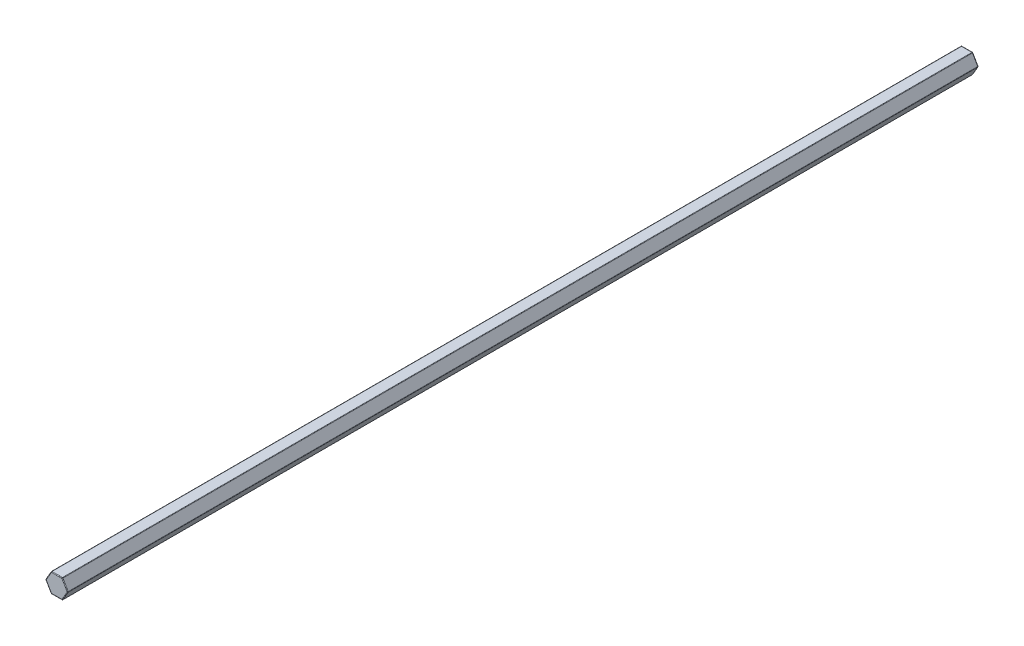
ISO-10303-21;
HEADER;
FILE_DESCRIPTION(('STEP AP214'),'2;1');
FILE_NAME('part.step','',(''),(''),'','','');
FILE_SCHEMA(('AUTOMOTIVE_DESIGN { 1 0 10303 214 1 1 1 1 }'));
ENDSEC;
DATA;
#1=APPLICATION_CONTEXT('core data for automotive mechanical design processes');
#2=APPLICATION_PROTOCOL_DEFINITION('international standard','automotive_design',2000,#1);
#3=PRODUCT_CONTEXT('',#1,'mechanical');
#4=PRODUCT('Part','Part','',(#3));
#5=PRODUCT_RELATED_PRODUCT_CATEGORY('part','',(#4));
#6=PRODUCT_DEFINITION_FORMATION('','',#4);
#7=PRODUCT_DEFINITION_CONTEXT('part definition',#1,'design');
#8=PRODUCT_DEFINITION('design','',#6,#7);
#9=PRODUCT_DEFINITION_SHAPE('','',#8);
#10=(LENGTH_UNIT() NAMED_UNIT(*) SI_UNIT(.MILLI.,.METRE.));
#11=(NAMED_UNIT(*) PLANE_ANGLE_UNIT() SI_UNIT($,.RADIAN.));
#12=(NAMED_UNIT(*) SI_UNIT($,.STERADIAN.) SOLID_ANGLE_UNIT());
#13=UNCERTAINTY_MEASURE_WITH_UNIT(LENGTH_MEASURE(1.E-05),#10,'distance_accuracy_value','');
#14=(GEOMETRIC_REPRESENTATION_CONTEXT(3) GLOBAL_UNCERTAINTY_ASSIGNED_CONTEXT((#13)) GLOBAL_UNIT_ASSIGNED_CONTEXT((#10,
#11,#12)) REPRESENTATION_CONTEXT('',''));
#15=CARTESIAN_POINT('',(0.,0.,0.));
#16=DIRECTION('',(0.,0.,1.));
#17=DIRECTION('',(1.,0.,0.));
#18=AXIS2_PLACEMENT_3D('',#15,#16,#17);
#19=CARTESIAN_POINT('',(1.8330871046771,-3.17499999999998,150.));
#20=DIRECTION('',(-0.866025403784441,0.499999999999995,0.));
#21=DIRECTION('',(-0.499999999999995,-0.866025403784441,0.));
#22=AXIS2_PLACEMENT_3D('',#19,#20,#21);
#23=PLANE('',#22);
#24=DIRECTION('',(0.,0.,-1.));
#25=VECTOR('',#24,1.);
#26=CARTESIAN_POINT('',(1.89082213159606,-3.07499999999998,150.));
#27=LINE('',#26,#25);
#28=CARTESIAN_POINT('',(1.89082213159606,-3.07499999999998,149.8));
#29=VERTEX_POINT('',#28);
#30=CARTESIAN_POINT('',(1.89082213159606,-3.07499999999998,-149.8));
#31=VERTEX_POINT('',#30);
#32=EDGE_CURVE('E313',#29,#31,#27,.T.);
#33=ORIENTED_EDGE('',*,*,#32,.T.);
#34=DIRECTION('',(0.499999999999995,0.866025403784441,0.));
#35=VECTOR('',#34,1.);
#36=CARTESIAN_POINT('',(1.8330871046771,-3.17499999999998,-149.8));
#37=LINE('',#36,#35);
#38=CARTESIAN_POINT('',(3.60843918243517,-0.1,-149.8));
#39=VERTEX_POINT('',#38);
#40=EDGE_CURVE('E316',#31,#39,#37,.T.);
#41=ORIENTED_EDGE('',*,*,#40,.T.);
#42=DIRECTION('',(0.,0.,-1.));
#43=VECTOR('',#42,1.);
#44=CARTESIAN_POINT('',(3.60843918243516,-0.1,150.));
#45=LINE('',#44,#43);
#46=CARTESIAN_POINT('',(3.60843918243517,-0.1,149.8));
#47=VERTEX_POINT('',#46);
#48=EDGE_CURVE('E311',#39,#47,#45,.F.);
#49=ORIENTED_EDGE('',*,*,#48,.T.);
#50=DIRECTION('',(0.499999999999995,0.866025403784441,0.));
#51=VECTOR('',#50,1.);
#52=CARTESIAN_POINT('',(1.8330871046771,-3.17499999999998,149.8));
#53=LINE('',#52,#51);
#54=EDGE_CURVE('E309',#47,#29,#53,.F.);
#55=ORIENTED_EDGE('',*,*,#54,.T.);
#56=EDGE_LOOP('',(#33,#41,#49,#55));
#57=FACE_BOUND('',#56,.T.);
#58=ADVANCED_FACE('F36',(#57),#23,.F.);
#59=CARTESIAN_POINT('',(3.66617420935413,0.,150.));
#60=DIRECTION('',(-0.866025403784438,-0.500000000000001,0.));
#61=DIRECTION('',(0.500000000000001,-0.866025403784438,0.));
#62=AXIS2_PLACEMENT_3D('',#59,#60,#61);
#63=PLANE('',#62);
#64=DIRECTION('',(0.,0.,-1.));
#65=VECTOR('',#64,1.);
#66=CARTESIAN_POINT('',(3.60843918243516,0.0999999999999989,150.));
#67=LINE('',#66,#65);
#68=CARTESIAN_POINT('',(3.60843918243516,0.0999999999999988,149.8));
#69=VERTEX_POINT('',#68);
#70=CARTESIAN_POINT('',(3.60843918243516,0.0999999999999989,-149.8));
#71=VERTEX_POINT('',#70);
#72=EDGE_CURVE('E170',#69,#71,#67,.T.);
#73=ORIENTED_EDGE('',*,*,#72,.T.);
#74=DIRECTION('',(-0.500000000000001,0.866025403784438,0.));
#75=VECTOR('',#74,1.);
#76=CARTESIAN_POINT('',(3.66617420935413,0.,-149.8));
#77=LINE('',#76,#75);
#78=CARTESIAN_POINT('',(1.89082213159602,3.07500000000001,-149.8));
#79=VERTEX_POINT('',#78);
#80=EDGE_CURVE('E166',#71,#79,#77,.T.);
#81=ORIENTED_EDGE('',*,*,#80,.T.);
#82=DIRECTION('',(0.,0.,-1.));
#83=VECTOR('',#82,1.);
#84=CARTESIAN_POINT('',(1.89082213159602,3.07500000000001,150.));
#85=LINE('',#84,#83);
#86=CARTESIAN_POINT('',(1.89082213159602,3.07500000000001,149.8));
#87=VERTEX_POINT('',#86);
#88=EDGE_CURVE('E160',#79,#87,#85,.F.);
#89=ORIENTED_EDGE('',*,*,#88,.T.);
#90=DIRECTION('',(-0.500000000000001,0.866025403784438,0.));
#91=VECTOR('',#90,1.);
#92=CARTESIAN_POINT('',(3.66617420935413,0.,149.8));
#93=LINE('',#92,#91);
#94=EDGE_CURVE('E163',#87,#69,#93,.F.);
#95=ORIENTED_EDGE('',*,*,#94,.T.);
#96=EDGE_LOOP('',(#73,#81,#89,#95));
#97=FACE_BOUND('',#96,.T.);
#98=ADVANCED_FACE('F162',(#97),#63,.F.);
#99=CARTESIAN_POINT('',(1.83308710467706,3.17500000000001,150.));
#100=DIRECTION('',(0.,-1.,0.));
#101=DIRECTION('',(1.,0.,0.));
#102=AXIS2_PLACEMENT_3D('',#99,#100,#101);
#103=PLANE('',#102);
#104=DIRECTION('',(0.,0.,-1.));
#105=VECTOR('',#104,1.);
#106=CARTESIAN_POINT('',(1.71761705083913,3.17500000000001,150.));
#107=LINE('',#106,#105);
#108=CARTESIAN_POINT('',(1.71761705083913,3.17500000000001,149.8));
#109=VERTEX_POINT('',#108);
#110=CARTESIAN_POINT('',(1.71761705083913,3.17500000000001,-149.8));
#111=VERTEX_POINT('',#110);
#112=EDGE_CURVE('E193',#109,#111,#107,.T.);
#113=ORIENTED_EDGE('',*,*,#112,.T.);
#114=DIRECTION('',(-1.,0.,0.));
#115=VECTOR('',#114,1.);
#116=CARTESIAN_POINT('',(1.83308710467706,3.17500000000001,-149.8));
#117=LINE('',#116,#115);
#118=CARTESIAN_POINT('',(-1.71761705083915,3.17499999999999,-149.8));
#119=VERTEX_POINT('',#118);
#120=EDGE_CURVE('E323',#111,#119,#117,.T.);
#121=ORIENTED_EDGE('',*,*,#120,.T.);
#122=DIRECTION('',(0.,0.,-1.));
#123=VECTOR('',#122,1.);
#124=CARTESIAN_POINT('',(-1.71761705083915,3.17499999999999,150.));
#125=LINE('',#124,#123);
#126=CARTESIAN_POINT('',(-1.71761705083915,3.17499999999999,149.8));
#127=VERTEX_POINT('',#126);
#128=EDGE_CURVE('E320',#119,#127,#125,.F.);
#129=ORIENTED_EDGE('',*,*,#128,.T.);
#130=DIRECTION('',(-1.,0.,0.));
#131=VECTOR('',#130,1.);
#132=CARTESIAN_POINT('',(1.83308710467706,3.17500000000001,149.8));
#133=LINE('',#132,#131);
#134=EDGE_CURVE('E318',#127,#109,#133,.F.);
#135=ORIENTED_EDGE('',*,*,#134,.T.);
#136=EDGE_LOOP('',(#113,#121,#129,#135));
#137=FACE_BOUND('',#136,.T.);
#138=ADVANCED_FACE('F442',(#137),#103,.F.);
#139=CARTESIAN_POINT('',(-1.83308710467708,3.17499999999999,150.));
#140=DIRECTION('',(0.866025403784442,-0.499999999999995,0.));
#141=DIRECTION('',(0.499999999999995,0.866025403784442,0.));
#142=AXIS2_PLACEMENT_3D('',#139,#140,#141);
#143=PLANE('',#142);
#144=DIRECTION('',(0.,0.,-1.));
#145=VECTOR('',#144,1.);
#146=CARTESIAN_POINT('',(-1.89082213159604,3.07499999999999,150.));
#147=LINE('',#146,#145);
#148=CARTESIAN_POINT('',(-1.89082213159604,3.07499999999999,149.8));
#149=VERTEX_POINT('',#148);
#150=CARTESIAN_POINT('',(-1.89082213159604,3.07499999999999,-149.8));
#151=VERTEX_POINT('',#150);
#152=EDGE_CURVE('E378',#149,#151,#147,.T.);
#153=ORIENTED_EDGE('',*,*,#152,.T.);
#154=DIRECTION('',(-0.499999999999995,-0.866025403784442,0.));
#155=VECTOR('',#154,1.);
#156=CARTESIAN_POINT('',(-1.83308710467708,3.17499999999999,-149.8));
#157=LINE('',#156,#155);
#158=CARTESIAN_POINT('',(-3.60843918243516,0.0999999999999749,-149.8));
#159=VERTEX_POINT('',#158);
#160=EDGE_CURVE('E382',#151,#159,#157,.T.);
#161=ORIENTED_EDGE('',*,*,#160,.T.);
#162=DIRECTION('',(0.,0.,-1.));
#163=VECTOR('',#162,1.);
#164=CARTESIAN_POINT('',(-3.60843918243516,0.0999999999999751,150.));
#165=LINE('',#164,#163);
#166=CARTESIAN_POINT('',(-3.60843918243516,0.0999999999999749,149.8));
#167=VERTEX_POINT('',#166);
#168=EDGE_CURVE('E380',#159,#167,#165,.F.);
#169=ORIENTED_EDGE('',*,*,#168,.T.);
#170=DIRECTION('',(-0.499999999999995,-0.866025403784442,0.));
#171=VECTOR('',#170,1.);
#172=CARTESIAN_POINT('',(-1.83308710467708,3.17499999999999,149.8));
#173=LINE('',#172,#171);
#174=EDGE_CURVE('E376',#167,#149,#173,.F.);
#175=ORIENTED_EDGE('',*,*,#174,.T.);
#176=EDGE_LOOP('',(#153,#161,#169,#175));
#177=FACE_BOUND('',#176,.T.);
#178=ADVANCED_FACE('F512',(#177),#143,.F.);
#179=CARTESIAN_POINT('',(-3.66617420935413,0.,150.));
#180=DIRECTION('',(0.866025403784434,0.500000000000007,0.));
#181=DIRECTION('',(-0.500000000000007,0.866025403784435,0.));
#182=AXIS2_PLACEMENT_3D('',#179,#180,#181);
#183=PLANE('',#182);
#184=DIRECTION('',(0.,0.,-1.));
#185=VECTOR('',#184,1.);
#186=CARTESIAN_POINT('',(-3.60843918243516,-0.100000000000026,150.));
#187=LINE('',#186,#185);
#188=CARTESIAN_POINT('',(-3.60843918243516,-0.100000000000026,149.8));
#189=VERTEX_POINT('',#188);
#190=CARTESIAN_POINT('',(-3.60843918243516,-0.100000000000026,-149.8));
#191=VERTEX_POINT('',#190);
#192=EDGE_CURVE('E304',#189,#191,#187,.T.);
#193=ORIENTED_EDGE('',*,*,#192,.T.);
#194=DIRECTION('',(0.500000000000007,-0.866025403784435,0.));
#195=VECTOR('',#194,1.);
#196=CARTESIAN_POINT('',(-3.66617420935413,0.,-149.8));
#197=LINE('',#196,#195);
#198=CARTESIAN_POINT('',(-1.890822131596,-3.07500000000002,-149.8));
#199=VERTEX_POINT('',#198);
#200=EDGE_CURVE('E307',#191,#199,#197,.T.);
#201=ORIENTED_EDGE('',*,*,#200,.T.);
#202=DIRECTION('',(0.,0.,-1.));
#203=VECTOR('',#202,1.);
#204=CARTESIAN_POINT('',(-1.890822131596,-3.07500000000002,150.));
#205=LINE('',#204,#203);
#206=CARTESIAN_POINT('',(-1.890822131596,-3.07500000000002,149.8));
#207=VERTEX_POINT('',#206);
#208=EDGE_CURVE('E287',#199,#207,#205,.F.);
#209=ORIENTED_EDGE('',*,*,#208,.T.);
#210=DIRECTION('',(0.500000000000007,-0.866025403784435,0.));
#211=VECTOR('',#210,1.);
#212=CARTESIAN_POINT('',(-3.66617420935413,0.,149.8));
#213=LINE('',#212,#211);
#214=EDGE_CURVE('E296',#207,#189,#213,.F.);
#215=ORIENTED_EDGE('',*,*,#214,.T.);
#216=EDGE_LOOP('',(#193,#201,#209,#215));
#217=FACE_BOUND('',#216,.T.);
#218=ADVANCED_FACE('F551',(#217),#183,.F.);
#219=CARTESIAN_POINT('',(-1.83308710467703,-3.17500000000002,150.));
#220=DIRECTION('',(0.,1.,0.));
#221=DIRECTION('',(-1.,0.,0.));
#222=AXIS2_PLACEMENT_3D('',#219,#220,#221);
#223=PLANE('',#222);
#224=DIRECTION('',(0.,0.,-1.));
#225=VECTOR('',#224,1.);
#226=CARTESIAN_POINT('',(-1.71761705083911,-3.17500000000002,150.));
#227=LINE('',#226,#225);
#228=CARTESIAN_POINT('',(-1.71761705083911,-3.17500000000002,149.8));
#229=VERTEX_POINT('',#228);
#230=CARTESIAN_POINT('',(-1.71761705083911,-3.17500000000002,-149.8));
#231=VERTEX_POINT('',#230);
#232=EDGE_CURVE('E289',#229,#231,#227,.T.);
#233=ORIENTED_EDGE('',*,*,#232,.T.);
#234=DIRECTION('',(1.,0.,0.));
#235=VECTOR('',#234,1.);
#236=CARTESIAN_POINT('',(-1.83308710467703,-3.17500000000002,-149.8));
#237=LINE('',#236,#235);
#238=CARTESIAN_POINT('',(1.71761705083918,-3.17499999999998,-149.8));
#239=VERTEX_POINT('',#238);
#240=EDGE_CURVE('E293',#231,#239,#237,.T.);
#241=ORIENTED_EDGE('',*,*,#240,.T.);
#242=DIRECTION('',(0.,0.,-1.));
#243=VECTOR('',#242,1.);
#244=CARTESIAN_POINT('',(1.71761705083918,-3.17499999999998,150.));
#245=LINE('',#244,#243);
#246=CARTESIAN_POINT('',(1.71761705083918,-3.17499999999998,149.8));
#247=VERTEX_POINT('',#246);
#248=EDGE_CURVE('E294',#239,#247,#245,.F.);
#249=ORIENTED_EDGE('',*,*,#248,.T.);
#250=DIRECTION('',(1.,0.,0.));
#251=VECTOR('',#250,1.);
#252=CARTESIAN_POINT('',(-1.83308710467703,-3.17500000000002,149.8));
#253=LINE('',#252,#251);
#254=EDGE_CURVE('E298',#247,#229,#253,.F.);
#255=ORIENTED_EDGE('',*,*,#254,.T.);
#256=EDGE_LOOP('',(#233,#241,#249,#255));
#257=FACE_BOUND('',#256,.T.);
#258=ADVANCED_FACE('F385',(#257),#223,.F.);
#259=CARTESIAN_POINT('',(0.,0.,150.));
#260=DIRECTION('',(0.,0.,1.));
#261=DIRECTION('',(1.,0.,0.));
#262=AXIS2_PLACEMENT_3D('',#259,#260,#261);
#263=PLANE('',#262);
#264=DIRECTION('',(0.500000000000007,-0.866025403784435,0.));
#265=VECTOR('',#264,1.);
#266=CARTESIAN_POINT('',(-1.65988202392015,-3.07500000000002,150.));
#267=LINE('',#266,#265);
#268=CARTESIAN_POINT('',(-3.43523410167828,0.,150.));
#269=VERTEX_POINT('',#268);
#270=CARTESIAN_POINT('',(-1.71761705083911,-2.97500000000002,150.));
#271=VERTEX_POINT('',#270);
#272=EDGE_CURVE('E45',#269,#271,#267,.T.);
#273=ORIENTED_EDGE('',*,*,#272,.T.);
#274=DIRECTION('',(1.,0.,0.));
#275=VECTOR('',#274,1.);
#276=CARTESIAN_POINT('',(1.8330871046771,-2.97499999999998,150.));
#277=LINE('',#276,#275);
#278=CARTESIAN_POINT('',(1.71761705083917,-2.97499999999998,150.));
#279=VERTEX_POINT('',#278);
#280=EDGE_CURVE('E11',#271,#279,#277,.T.);
#281=ORIENTED_EDGE('',*,*,#280,.T.);
#282=DIRECTION('',(0.499999999999995,0.866025403784441,0.));
#283=VECTOR('',#282,1.);
#284=CARTESIAN_POINT('',(3.49296912859724,0.0999999999999987,150.));
#285=LINE('',#284,#283);
#286=CARTESIAN_POINT('',(3.43523410167828,0.,150.));
#287=VERTEX_POINT('',#286);
#288=EDGE_CURVE('E325',#279,#287,#285,.T.);
#289=ORIENTED_EDGE('',*,*,#288,.T.);
#290=DIRECTION('',(-0.500000000000001,0.866025403784438,0.));
#291=VECTOR('',#290,1.);
#292=CARTESIAN_POINT('',(1.65988202392017,3.07500000000001,150.));
#293=LINE('',#292,#291);
#294=CARTESIAN_POINT('',(1.71761705083913,2.97500000000001,150.));
#295=VERTEX_POINT('',#294);
#296=EDGE_CURVE('E327',#287,#295,#293,.T.);
#297=ORIENTED_EDGE('',*,*,#296,.T.);
#298=DIRECTION('',(-1.,0.,0.));
#299=VECTOR('',#298,1.);
#300=CARTESIAN_POINT('',(-1.83308710467708,2.97499999999999,150.));
#301=LINE('',#300,#299);
#302=CARTESIAN_POINT('',(-1.71761705083915,2.97499999999999,150.));
#303=VERTEX_POINT('',#302);
#304=EDGE_CURVE('E329',#295,#303,#301,.T.);
#305=ORIENTED_EDGE('',*,*,#304,.T.);
#306=DIRECTION('',(-0.499999999999995,-0.866025403784442,0.));
#307=VECTOR('',#306,1.);
#308=CARTESIAN_POINT('',(-3.49296912859724,-0.100000000000025,150.));
#309=LINE('',#308,#307);
#310=EDGE_CURVE('E56',#303,#269,#309,.T.);
#311=ORIENTED_EDGE('',*,*,#310,.T.);
#312=EDGE_LOOP('',(#273,#281,#289,#297,#305,#311));
#313=FACE_BOUND('',#312,.T.);
#314=ADVANCED_FACE('F390',(#313),#263,.T.);
#315=CARTESIAN_POINT('',(0.,0.,-150.));
#316=DIRECTION('',(0.,0.,1.));
#317=DIRECTION('',(1.,0.,0.));
#318=AXIS2_PLACEMENT_3D('',#315,#316,#317);
#319=PLANE('',#318);
#320=DIRECTION('',(0.499999999999995,0.866025403784441,0.));
#321=VECTOR('',#320,1.);
#322=CARTESIAN_POINT('',(2.57642557625873,-1.48749999999999,-150.));
#323=LINE('',#322,#321);
#324=CARTESIAN_POINT('',(3.43523410167828,0.,-150.));
#325=VERTEX_POINT('',#324);
#326=CARTESIAN_POINT('',(1.71761705083917,-2.97499999999998,-150.));
#327=VERTEX_POINT('',#326);
#328=EDGE_CURVE('E352',#325,#327,#323,.F.);
#329=ORIENTED_EDGE('',*,*,#328,.T.);
#330=DIRECTION('',(1.,0.,0.));
#331=VECTOR('',#330,1.);
#332=CARTESIAN_POINT('',(0.,-2.975,-150.));
#333=LINE('',#332,#331);
#334=CARTESIAN_POINT('',(-1.71761705083911,-2.97500000000002,-150.));
#335=VERTEX_POINT('',#334);
#336=EDGE_CURVE('E374',#327,#335,#333,.F.);
#337=ORIENTED_EDGE('',*,*,#336,.T.);
#338=DIRECTION('',(0.500000000000007,-0.866025403784435,0.));
#339=VECTOR('',#338,1.);
#340=CARTESIAN_POINT('',(-2.57642557625869,-1.48750000000002,-150.));
#341=LINE('',#340,#339);
#342=CARTESIAN_POINT('',(-3.43523410167828,0.,-150.));
#343=VERTEX_POINT('',#342);
#344=EDGE_CURVE('E358',#335,#343,#341,.F.);
#345=ORIENTED_EDGE('',*,*,#344,.T.);
#346=DIRECTION('',(-0.499999999999995,-0.866025403784442,0.));
#347=VECTOR('',#346,1.);
#348=CARTESIAN_POINT('',(-2.57642557625871,1.48749999999998,-150.));
#349=LINE('',#348,#347);
#350=CARTESIAN_POINT('',(-1.71761705083915,2.97499999999999,-150.));
#351=VERTEX_POINT('',#350);
#352=EDGE_CURVE('E368',#343,#351,#349,.F.);
#353=ORIENTED_EDGE('',*,*,#352,.T.);
#354=DIRECTION('',(-1.,0.,0.));
#355=VECTOR('',#354,1.);
#356=CARTESIAN_POINT('',(0.,2.975,-150.));
#357=LINE('',#356,#355);
#358=CARTESIAN_POINT('',(1.71761705083913,2.97500000000001,-150.));
#359=VERTEX_POINT('',#358);
#360=EDGE_CURVE('E364',#351,#359,#357,.F.);
#361=ORIENTED_EDGE('',*,*,#360,.T.);
#362=DIRECTION('',(-0.500000000000001,0.866025403784438,0.));
#363=VECTOR('',#362,1.);
#364=CARTESIAN_POINT('',(2.5764255762587,1.4875,-150.));
#365=LINE('',#364,#363);
#366=EDGE_CURVE('E359',#359,#325,#365,.F.);
#367=ORIENTED_EDGE('',*,*,#366,.T.);
#368=EDGE_LOOP('',(#329,#337,#345,#353,#361,#367));
#369=FACE_BOUND('',#368,.T.);
#370=ADVANCED_FACE('F362',(#369),#319,.F.);
#371=CARTESIAN_POINT('',(-2.57642557625869,-1.48750000000002,149.8));
#372=DIRECTION('',(-0.500000000000007,0.866025403784435,0.));
#373=DIRECTION('',(-0.866025403784434,-0.500000000000007,0.));
#374=AXIS2_PLACEMENT_3D('',#371,#372,#373);
#375=CYLINDRICAL_SURFACE('',#374,0.2);
#376=CARTESIAN_POINT('',(-1.71761705083911,-2.97500000000002,149.8));
#377=DIRECTION('',(0.500000000000008,-0.866025403784434,0.));
#378=DIRECTION('',(0.866025403784434,0.500000000000008,0.));
#379=AXIS2_PLACEMENT_3D('',#376,#377,#378);
#380=CIRCLE('',#379,0.2);
#381=EDGE_CURVE('E40',#271,#207,#380,.T.);
#382=ORIENTED_EDGE('',*,*,#381,.F.);
#383=ORIENTED_EDGE('',*,*,#272,.F.);
#384=CARTESIAN_POINT('',(-3.43523410167828,0.,149.8));
#385=DIRECTION('',(-0.500000000000007,0.866025403784435,0.));
#386=DIRECTION('',(-0.866025403784434,-0.500000000000007,0.));
#387=AXIS2_PLACEMENT_3D('',#384,#385,#386);
#388=CIRCLE('',#387,0.2);
#389=EDGE_CURVE('E268',#189,#269,#388,.T.);
#390=ORIENTED_EDGE('',*,*,#389,.F.);
#391=ORIENTED_EDGE('',*,*,#214,.F.);
#392=EDGE_LOOP('',(#382,#383,#390,#391));
#393=FACE_BOUND('',#392,.T.);
#394=ADVANCED_FACE('F38',(#393),#375,.T.);
#395=CARTESIAN_POINT('',(-1.71761705083911,-2.97500000000002,149.8));
#396=DIRECTION('',(0.,0.,1.));
#397=DIRECTION('',(1.,0.,0.));
#398=AXIS2_PLACEMENT_3D('',#395,#396,#397);
#399=SPHERICAL_SURFACE('',#398,0.2);
#400=CARTESIAN_POINT('',(-1.71761705083911,-2.97500000000002,149.8));
#401=DIRECTION('',(-1.,0.,0.));
#402=DIRECTION('',(0.,-1.,0.));
#403=AXIS2_PLACEMENT_3D('',#400,#401,#402);
#404=CIRCLE('',#403,0.2);
#405=EDGE_CURVE('E263',#271,#229,#404,.F.);
#406=ORIENTED_EDGE('',*,*,#405,.F.);
#407=ORIENTED_EDGE('',*,*,#381,.T.);
#408=CARTESIAN_POINT('',(-1.71761705083911,-2.97500000000002,149.8));
#409=DIRECTION('',(0.,0.,1.));
#410=DIRECTION('',(1.,0.,0.));
#411=AXIS2_PLACEMENT_3D('',#408,#409,#410);
#412=CIRCLE('',#411,0.2);
#413=EDGE_CURVE('E266',#229,#207,#412,.F.);
#414=ORIENTED_EDGE('',*,*,#413,.F.);
#415=EDGE_LOOP('',(#406,#407,#414));
#416=FACE_BOUND('',#415,.T.);
#417=ADVANCED_FACE('F278',(#416),#399,.T.);
#418=CARTESIAN_POINT('',(-3.43523410167828,0.,149.8));
#419=DIRECTION('',(0.,0.,1.));
#420=DIRECTION('',(0.,-1.,0.));
#421=AXIS2_PLACEMENT_3D('',#418,#419,#420);
#422=SPHERICAL_SURFACE('',#421,0.2);
#423=CARTESIAN_POINT('',(-3.43523410167828,0.,149.8));
#424=DIRECTION('',(0.,0.,1.));
#425=DIRECTION('',(1.,0.,0.));
#426=AXIS2_PLACEMENT_3D('',#423,#424,#425);
#427=CIRCLE('',#426,0.2);
#428=EDGE_CURVE('E257',#189,#167,#427,.F.);
#429=ORIENTED_EDGE('',*,*,#428,.F.);
#430=ORIENTED_EDGE('',*,*,#389,.T.);
#431=CARTESIAN_POINT('',(-3.43523410167828,0.,149.8));
#432=DIRECTION('',(-0.499999999999996,-0.866025403784441,0.));
#433=DIRECTION('',(0.866025403784441,-0.499999999999996,0.));
#434=AXIS2_PLACEMENT_3D('',#431,#432,#433);
#435=CIRCLE('',#434,0.2);
#436=EDGE_CURVE('E260',#167,#269,#435,.F.);
#437=ORIENTED_EDGE('',*,*,#436,.F.);
#438=EDGE_LOOP('',(#429,#430,#437));
#439=FACE_BOUND('',#438,.T.);
#440=ADVANCED_FACE('F521',(#439),#422,.T.);
#441=CARTESIAN_POINT('',(-1.71761705083911,-2.97500000000002,150.));
#442=DIRECTION('',(0.,0.,-1.));
#443=DIRECTION('',(-1.,0.,0.));
#444=AXIS2_PLACEMENT_3D('',#441,#442,#443);
#445=CYLINDRICAL_SURFACE('',#444,0.2);
#446=ORIENTED_EDGE('',*,*,#413,.T.);
#447=ORIENTED_EDGE('',*,*,#208,.F.);
#448=CARTESIAN_POINT('',(-1.71761705083911,-2.97500000000002,-149.8));
#449=DIRECTION('',(0.,0.,-1.));
#450=DIRECTION('',(-1.,0.,0.));
#451=AXIS2_PLACEMENT_3D('',#448,#449,#450);
#452=CIRCLE('',#451,0.2);
#453=EDGE_CURVE('E251',#231,#199,#452,.T.);
#454=ORIENTED_EDGE('',*,*,#453,.F.);
#455=ORIENTED_EDGE('',*,*,#232,.F.);
#456=EDGE_LOOP('',(#446,#447,#454,#455));
#457=FACE_BOUND('',#456,.T.);
#458=ADVANCED_FACE('F285',(#457),#445,.T.);
#459=CARTESIAN_POINT('',(0.,-2.975,149.8));
#460=DIRECTION('',(-1.,0.,0.));
#461=DIRECTION('',(0.,-1.,0.));
#462=AXIS2_PLACEMENT_3D('',#459,#460,#461);
#463=CYLINDRICAL_SURFACE('',#462,0.2);
#464=ORIENTED_EDGE('',*,*,#405,.T.);
#465=ORIENTED_EDGE('',*,*,#254,.F.);
#466=CARTESIAN_POINT('',(1.71761705083917,-2.97499999999998,149.8));
#467=DIRECTION('',(1.,0.,0.));
#468=DIRECTION('',(0.,1.,0.));
#469=AXIS2_PLACEMENT_3D('',#466,#467,#468);
#470=CIRCLE('',#469,0.2);
#471=EDGE_CURVE('E248',#279,#247,#470,.T.);
#472=ORIENTED_EDGE('',*,*,#471,.F.);
#473=ORIENTED_EDGE('',*,*,#280,.F.);
#474=EDGE_LOOP('',(#464,#465,#472,#473));
#475=FACE_BOUND('',#474,.T.);
#476=ADVANCED_FACE('F389',(#475),#463,.T.);
#477=CARTESIAN_POINT('',(-2.57642557625871,1.48749999999998,149.8));
#478=DIRECTION('',(0.499999999999995,0.866025403784442,0.));
#479=DIRECTION('',(-0.866025403784442,0.499999999999995,0.));
#480=AXIS2_PLACEMENT_3D('',#477,#478,#479);
#481=CYLINDRICAL_SURFACE('',#480,0.2);
#482=ORIENTED_EDGE('',*,*,#436,.T.);
#483=ORIENTED_EDGE('',*,*,#310,.F.);
#484=CARTESIAN_POINT('',(-1.71761705083915,2.97499999999999,149.8));
#485=DIRECTION('',(0.499999999999995,0.866025403784442,0.));
#486=DIRECTION('',(-0.866025403784442,0.499999999999995,0.));
#487=AXIS2_PLACEMENT_3D('',#484,#485,#486);
#488=CIRCLE('',#487,0.2);
#489=EDGE_CURVE('E245',#149,#303,#488,.T.);
#490=ORIENTED_EDGE('',*,*,#489,.F.);
#491=ORIENTED_EDGE('',*,*,#174,.F.);
#492=EDGE_LOOP('',(#482,#483,#490,#491));
#493=FACE_BOUND('',#492,.T.);
#494=ADVANCED_FACE('F523',(#493),#481,.T.);
#495=CARTESIAN_POINT('',(-3.43523410167828,0.,150.));
#496=DIRECTION('',(0.,0.,-1.));
#497=DIRECTION('',(-1.,0.,0.));
#498=AXIS2_PLACEMENT_3D('',#495,#496,#497);
#499=CYLINDRICAL_SURFACE('',#498,0.2);
#500=ORIENTED_EDGE('',*,*,#428,.T.);
#501=ORIENTED_EDGE('',*,*,#168,.F.);
#502=CARTESIAN_POINT('',(-3.43523410167828,0.,-149.8));
#503=DIRECTION('',(0.,0.,-1.));
#504=DIRECTION('',(-1.,0.,0.));
#505=AXIS2_PLACEMENT_3D('',#502,#503,#504);
#506=CIRCLE('',#505,0.2);
#507=EDGE_CURVE('E242',#191,#159,#506,.T.);
#508=ORIENTED_EDGE('',*,*,#507,.F.);
#509=ORIENTED_EDGE('',*,*,#192,.F.);
#510=EDGE_LOOP('',(#500,#501,#508,#509));
#511=FACE_BOUND('',#510,.T.);
#512=ADVANCED_FACE('F435',(#511),#499,.T.);
#513=CARTESIAN_POINT('',(-3.49296912859724,0.0999999999999758,-149.8));
#514=DIRECTION('',(0.500000000000007,-0.866025403784435,0.));
#515=DIRECTION('',(0.866025403784434,0.500000000000007,0.));
#516=AXIS2_PLACEMENT_3D('',#513,#514,#515);
#517=CYLINDRICAL_SURFACE('',#516,0.2);
#518=CARTESIAN_POINT('',(-1.71761705083911,-2.97500000000002,-149.8));
#519=DIRECTION('',(0.500000000000008,-0.866025403784434,0.));
#520=DIRECTION('',(0.866025403784434,0.500000000000008,0.));
#521=AXIS2_PLACEMENT_3D('',#518,#519,#520);
#522=CIRCLE('',#521,0.2);
#523=EDGE_CURVE('E254',#199,#335,#522,.T.);
#524=ORIENTED_EDGE('',*,*,#523,.F.);
#525=ORIENTED_EDGE('',*,*,#200,.F.);
#526=CARTESIAN_POINT('',(-3.43523410167828,0.,-149.8));
#527=DIRECTION('',(-0.500000000000009,0.866025403784433,0.));
#528=DIRECTION('',(-0.866025403784433,-0.500000000000009,0.));
#529=AXIS2_PLACEMENT_3D('',#526,#527,#528);
#530=CIRCLE('',#529,0.2);
#531=EDGE_CURVE('E240',#343,#191,#530,.T.);
#532=ORIENTED_EDGE('',*,*,#531,.F.);
#533=ORIENTED_EDGE('',*,*,#344,.F.);
#534=EDGE_LOOP('',(#524,#525,#532,#533));
#535=FACE_BOUND('',#534,.T.);
#536=ADVANCED_FACE('F420',(#535),#517,.T.);
#537=CARTESIAN_POINT('',(-1.71761705083911,-2.97500000000002,-149.8));
#538=DIRECTION('',(0.,0.,-1.));
#539=DIRECTION('',(-1.,0.,0.));
#540=AXIS2_PLACEMENT_3D('',#537,#538,#539);
#541=SPHERICAL_SURFACE('',#540,0.2);
#542=ORIENTED_EDGE('',*,*,#453,.T.);
#543=ORIENTED_EDGE('',*,*,#523,.T.);
#544=CARTESIAN_POINT('',(-1.71761705083911,-2.97500000000002,-149.8));
#545=DIRECTION('',(-1.,0.,0.));
#546=DIRECTION('',(0.,-1.,0.));
#547=AXIS2_PLACEMENT_3D('',#544,#545,#546);
#548=CIRCLE('',#547,0.2);
#549=EDGE_CURVE('E237',#231,#335,#548,.F.);
#550=ORIENTED_EDGE('',*,*,#549,.F.);
#551=EDGE_LOOP('',(#542,#543,#550));
#552=FACE_BOUND('',#551,.T.);
#553=ADVANCED_FACE('F424',(#552),#541,.T.);
#554=CARTESIAN_POINT('',(1.71761705083917,-2.97499999999998,149.8));
#555=DIRECTION('',(0.,0.,1.));
#556=DIRECTION('',(1.,0.,0.));
#557=AXIS2_PLACEMENT_3D('',#554,#555,#556);
#558=SPHERICAL_SURFACE('',#557,0.2);
#559=CARTESIAN_POINT('',(1.71761705083917,-2.97499999999998,149.8));
#560=DIRECTION('',(-0.499999999999995,-0.866025403784441,0.));
#561=DIRECTION('',(0.866025403784442,-0.499999999999995,0.));
#562=AXIS2_PLACEMENT_3D('',#559,#560,#561);
#563=CIRCLE('',#562,0.2);
#564=EDGE_CURVE('E231',#279,#29,#563,.F.);
#565=ORIENTED_EDGE('',*,*,#564,.F.);
#566=ORIENTED_EDGE('',*,*,#471,.T.);
#567=CARTESIAN_POINT('',(1.71761705083917,-2.97499999999998,149.8));
#568=DIRECTION('',(0.,0.,1.));
#569=DIRECTION('',(1.,0.,0.));
#570=AXIS2_PLACEMENT_3D('',#567,#568,#569);
#571=CIRCLE('',#570,0.2);
#572=EDGE_CURVE('E234',#29,#247,#571,.F.);
#573=ORIENTED_EDGE('',*,*,#572,.F.);
#574=EDGE_LOOP('',(#565,#566,#573));
#575=FACE_BOUND('',#574,.T.);
#576=ADVANCED_FACE('F426',(#575),#558,.T.);
#577=CARTESIAN_POINT('',(-1.71761705083915,2.97499999999999,149.8));
#578=DIRECTION('',(0.,0.,1.));
#579=DIRECTION('',(1.,0.,0.));
#580=AXIS2_PLACEMENT_3D('',#577,#578,#579);
#581=SPHERICAL_SURFACE('',#580,0.2);
#582=CARTESIAN_POINT('',(-1.71761705083915,2.97499999999999,149.8));
#583=DIRECTION('',(0.,0.,1.));
#584=DIRECTION('',(1.,0.,0.));
#585=AXIS2_PLACEMENT_3D('',#582,#583,#584);
#586=CIRCLE('',#585,0.2);
#587=EDGE_CURVE('E225',#149,#127,#586,.F.);
#588=ORIENTED_EDGE('',*,*,#587,.F.);
#589=ORIENTED_EDGE('',*,*,#489,.T.);
#590=CARTESIAN_POINT('',(-1.71761705083915,2.97499999999999,149.8));
#591=DIRECTION('',(-1.,0.,0.));
#592=DIRECTION('',(0.,-1.,0.));
#593=AXIS2_PLACEMENT_3D('',#590,#591,#592);
#594=CIRCLE('',#593,0.2);
#595=EDGE_CURVE('E228',#127,#303,#594,.F.);
#596=ORIENTED_EDGE('',*,*,#595,.F.);
#597=EDGE_LOOP('',(#588,#589,#596));
#598=FACE_BOUND('',#597,.T.);
#599=ADVANCED_FACE('F432',(#598),#581,.T.);
#600=CARTESIAN_POINT('',(-3.43523410167828,0.,-149.8));
#601=DIRECTION('',(0.,0.,-1.));
#602=DIRECTION('',(-1.,0.,0.));
#603=AXIS2_PLACEMENT_3D('',#600,#601,#602);
#604=SPHERICAL_SURFACE('',#603,0.2);
#605=ORIENTED_EDGE('',*,*,#531,.T.);
#606=ORIENTED_EDGE('',*,*,#507,.T.);
#607=CARTESIAN_POINT('',(-3.43523410167828,0.,-149.8));
#608=DIRECTION('',(-0.499999999999995,-0.866025403784441,0.));
#609=DIRECTION('',(0.866025403784441,-0.499999999999995,0.));
#610=AXIS2_PLACEMENT_3D('',#607,#608,#609);
#611=CIRCLE('',#610,0.2);
#612=EDGE_CURVE('E223',#343,#159,#611,.F.);
#613=ORIENTED_EDGE('',*,*,#612,.F.);
#614=EDGE_LOOP('',(#605,#606,#613));
#615=FACE_BOUND('',#614,.T.);
#616=ADVANCED_FACE('F495',(#615),#604,.T.);
#617=CARTESIAN_POINT('',(-1.83308710467704,-2.97500000000002,-149.8));
#618=DIRECTION('',(1.,0.,0.));
#619=DIRECTION('',(0.,1.,0.));
#620=AXIS2_PLACEMENT_3D('',#617,#618,#619);
#621=CYLINDRICAL_SURFACE('',#620,0.2);
#622=ORIENTED_EDGE('',*,*,#549,.T.);
#623=ORIENTED_EDGE('',*,*,#336,.F.);
#624=CARTESIAN_POINT('',(1.71761705083917,-2.97499999999998,-149.8));
#625=DIRECTION('',(1.,0.,0.));
#626=DIRECTION('',(0.,1.,0.));
#627=AXIS2_PLACEMENT_3D('',#624,#625,#626);
#628=CIRCLE('',#627,0.2);
#629=EDGE_CURVE('E220',#239,#327,#628,.T.);
#630=ORIENTED_EDGE('',*,*,#629,.F.);
#631=ORIENTED_EDGE('',*,*,#240,.F.);
#632=EDGE_LOOP('',(#622,#623,#630,#631));
#633=FACE_BOUND('',#632,.T.);
#634=ADVANCED_FACE('F416',(#633),#621,.T.);
#635=CARTESIAN_POINT('',(1.71761705083917,-2.97499999999998,150.));
#636=DIRECTION('',(0.,0.,-1.));
#637=DIRECTION('',(-1.,0.,0.));
#638=AXIS2_PLACEMENT_3D('',#635,#636,#637);
#639=CYLINDRICAL_SURFACE('',#638,0.2);
#640=ORIENTED_EDGE('',*,*,#572,.T.);
#641=ORIENTED_EDGE('',*,*,#248,.F.);
#642=CARTESIAN_POINT('',(1.71761705083917,-2.97499999999998,-149.8));
#643=DIRECTION('',(0.,0.,-1.));
#644=DIRECTION('',(-1.,0.,0.));
#645=AXIS2_PLACEMENT_3D('',#642,#643,#644);
#646=CIRCLE('',#645,0.2);
#647=EDGE_CURVE('E218',#31,#239,#646,.T.);
#648=ORIENTED_EDGE('',*,*,#647,.F.);
#649=ORIENTED_EDGE('',*,*,#32,.F.);
#650=EDGE_LOOP('',(#640,#641,#648,#649));
#651=FACE_BOUND('',#650,.T.);
#652=ADVANCED_FACE('F412',(#651),#639,.T.);
#653=CARTESIAN_POINT('',(2.57642557625873,-1.48749999999999,149.8));
#654=DIRECTION('',(-0.499999999999995,-0.866025403784441,0.));
#655=DIRECTION('',(0.866025403784441,-0.499999999999995,0.));
#656=AXIS2_PLACEMENT_3D('',#653,#654,#655);
#657=CYLINDRICAL_SURFACE('',#656,0.2);
#658=ORIENTED_EDGE('',*,*,#564,.T.);
#659=ORIENTED_EDGE('',*,*,#54,.F.);
#660=CARTESIAN_POINT('',(3.43523410167828,0.,149.8));
#661=DIRECTION('',(0.499999999999993,0.866025403784442,0.));
#662=DIRECTION('',(-0.866025403784443,0.499999999999993,0.));
#663=AXIS2_PLACEMENT_3D('',#660,#661,#662);
#664=CIRCLE('',#663,0.2);
#665=EDGE_CURVE('E215',#287,#47,#664,.T.);
#666=ORIENTED_EDGE('',*,*,#665,.F.);
#667=ORIENTED_EDGE('',*,*,#288,.F.);
#668=EDGE_LOOP('',(#658,#659,#666,#667));
#669=FACE_BOUND('',#668,.T.);
#670=ADVANCED_FACE('F396',(#669),#657,.T.);
#671=CARTESIAN_POINT('',(2.5764255762587,1.4875,149.8));
#672=DIRECTION('',(0.500000000000001,-0.866025403784438,0.));
#673=DIRECTION('',(0.866025403784438,0.500000000000001,0.));
#674=AXIS2_PLACEMENT_3D('',#671,#672,#673);
#675=CYLINDRICAL_SURFACE('',#674,0.2);
#676=CARTESIAN_POINT('',(1.71761705083913,2.97500000000001,149.8));
#677=DIRECTION('',(-0.5,0.866025403784439,0.));
#678=DIRECTION('',(-0.866025403784439,-0.5,0.));
#679=AXIS2_PLACEMENT_3D('',#676,#677,#678);
#680=CIRCLE('',#679,0.2);
#681=EDGE_CURVE('E177',#295,#87,#680,.T.);
#682=ORIENTED_EDGE('',*,*,#681,.F.);
#683=ORIENTED_EDGE('',*,*,#296,.F.);
#684=CARTESIAN_POINT('',(3.43523410167828,0.,149.8));
#685=DIRECTION('',(0.500000000000001,-0.866025403784438,0.));
#686=DIRECTION('',(0.866025403784438,0.500000000000001,0.));
#687=AXIS2_PLACEMENT_3D('',#684,#685,#686);
#688=CIRCLE('',#687,0.2);
#689=EDGE_CURVE('E180',#69,#287,#688,.T.);
#690=ORIENTED_EDGE('',*,*,#689,.F.);
#691=ORIENTED_EDGE('',*,*,#94,.F.);
#692=EDGE_LOOP('',(#682,#683,#690,#691));
#693=FACE_BOUND('',#692,.T.);
#694=ADVANCED_FACE('F175',(#693),#675,.T.);
#695=CARTESIAN_POINT('',(0.,2.975,149.8));
#696=DIRECTION('',(1.,0.,0.));
#697=DIRECTION('',(0.,1.,0.));
#698=AXIS2_PLACEMENT_3D('',#695,#696,#697);
#699=CYLINDRICAL_SURFACE('',#698,0.2);
#700=ORIENTED_EDGE('',*,*,#595,.T.);
#701=ORIENTED_EDGE('',*,*,#304,.F.);
#702=CARTESIAN_POINT('',(1.71761705083913,2.97500000000001,149.8));
#703=DIRECTION('',(1.,0.,0.));
#704=DIRECTION('',(0.,1.,0.));
#705=AXIS2_PLACEMENT_3D('',#702,#703,#704);
#706=CIRCLE('',#705,0.2);
#707=EDGE_CURVE('E189',#109,#295,#706,.T.);
#708=ORIENTED_EDGE('',*,*,#707,.F.);
#709=ORIENTED_EDGE('',*,*,#134,.F.);
#710=EDGE_LOOP('',(#700,#701,#708,#709));
#711=FACE_BOUND('',#710,.T.);
#712=ADVANCED_FACE('F482',(#711),#699,.T.);
#713=CARTESIAN_POINT('',(-1.71761705083915,2.97499999999999,150.));
#714=DIRECTION('',(0.,0.,-1.));
#715=DIRECTION('',(-1.,0.,0.));
#716=AXIS2_PLACEMENT_3D('',#713,#714,#715);
#717=CYLINDRICAL_SURFACE('',#716,0.2);
#718=ORIENTED_EDGE('',*,*,#587,.T.);
#719=ORIENTED_EDGE('',*,*,#128,.F.);
#720=CARTESIAN_POINT('',(-1.71761705083915,2.97499999999999,-149.8));
#721=DIRECTION('',(0.,0.,-1.));
#722=DIRECTION('',(-1.,0.,0.));
#723=AXIS2_PLACEMENT_3D('',#720,#721,#722);
#724=CIRCLE('',#723,0.2);
#725=EDGE_CURVE('E210',#151,#119,#724,.T.);
#726=ORIENTED_EDGE('',*,*,#725,.F.);
#727=ORIENTED_EDGE('',*,*,#152,.F.);
#728=EDGE_LOOP('',(#718,#719,#726,#727));
#729=FACE_BOUND('',#728,.T.);
#730=ADVANCED_FACE('F478',(#729),#717,.T.);
#731=CARTESIAN_POINT('',(-1.65988202392019,3.075,-149.8));
#732=DIRECTION('',(-0.499999999999995,-0.866025403784442,0.));
#733=DIRECTION('',(0.866025403784442,-0.499999999999995,0.));
#734=AXIS2_PLACEMENT_3D('',#731,#732,#733);
#735=CYLINDRICAL_SURFACE('',#734,0.2);
#736=ORIENTED_EDGE('',*,*,#612,.T.);
#737=ORIENTED_EDGE('',*,*,#160,.F.);
#738=CARTESIAN_POINT('',(-1.71761705083915,2.97499999999999,-149.8));
#739=DIRECTION('',(0.499999999999995,0.866025403784441,0.));
#740=DIRECTION('',(-0.866025403784442,0.499999999999995,0.));
#741=AXIS2_PLACEMENT_3D('',#738,#739,#740);
#742=CIRCLE('',#741,0.2);
#743=EDGE_CURVE('E207',#351,#151,#742,.T.);
#744=ORIENTED_EDGE('',*,*,#743,.F.);
#745=ORIENTED_EDGE('',*,*,#352,.F.);
#746=EDGE_LOOP('',(#736,#737,#744,#745));
#747=FACE_BOUND('',#746,.T.);
#748=ADVANCED_FACE('F475',(#747),#735,.T.);
#749=CARTESIAN_POINT('',(1.71761705083917,-2.97499999999998,-149.8));
#750=DIRECTION('',(0.,0.,-1.));
#751=DIRECTION('',(-1.,0.,0.));
#752=AXIS2_PLACEMENT_3D('',#749,#750,#751);
#753=SPHERICAL_SURFACE('',#752,0.2);
#754=ORIENTED_EDGE('',*,*,#647,.T.);
#755=ORIENTED_EDGE('',*,*,#629,.T.);
#756=CARTESIAN_POINT('',(1.71761705083917,-2.97499999999998,-149.8));
#757=DIRECTION('',(-0.499999999999995,-0.866025403784441,0.));
#758=DIRECTION('',(0.866025403784442,-0.499999999999995,0.));
#759=AXIS2_PLACEMENT_3D('',#756,#757,#758);
#760=CIRCLE('',#759,0.2);
#761=EDGE_CURVE('E198',#31,#327,#760,.F.);
#762=ORIENTED_EDGE('',*,*,#761,.F.);
#763=EDGE_LOOP('',(#754,#755,#762));
#764=FACE_BOUND('',#763,.T.);
#765=ADVANCED_FACE('F409',(#764),#753,.T.);
#766=CARTESIAN_POINT('',(3.43523410167828,0.,149.8));
#767=DIRECTION('',(0.,0.,1.));
#768=DIRECTION('',(0.,-1.,0.));
#769=AXIS2_PLACEMENT_3D('',#766,#767,#768);
#770=SPHERICAL_SURFACE('',#769,0.2);
#771=ORIENTED_EDGE('',*,*,#689,.T.);
#772=ORIENTED_EDGE('',*,*,#665,.T.);
#773=CARTESIAN_POINT('',(3.43523410167828,0.,149.8));
#774=DIRECTION('',(0.,0.,1.));
#775=DIRECTION('',(1.,0.,0.));
#776=AXIS2_PLACEMENT_3D('',#773,#774,#775);
#777=CIRCLE('',#776,0.2);
#778=EDGE_CURVE('E194',#69,#47,#777,.F.);
#779=ORIENTED_EDGE('',*,*,#778,.F.);
#780=EDGE_LOOP('',(#771,#772,#779));
#781=FACE_BOUND('',#780,.T.);
#782=ADVANCED_FACE('F398',(#781),#770,.T.);
#783=CARTESIAN_POINT('',(1.71761705083913,2.97500000000001,149.8));
#784=DIRECTION('',(0.,0.,1.));
#785=DIRECTION('',(1.,0.,0.));
#786=AXIS2_PLACEMENT_3D('',#783,#784,#785);
#787=SPHERICAL_SURFACE('',#786,0.2);
#788=ORIENTED_EDGE('',*,*,#707,.T.);
#789=ORIENTED_EDGE('',*,*,#681,.T.);
#790=CARTESIAN_POINT('',(1.71761705083913,2.97500000000001,149.8));
#791=DIRECTION('',(0.,0.,1.));
#792=DIRECTION('',(1.,0.,0.));
#793=AXIS2_PLACEMENT_3D('',#790,#791,#792);
#794=CIRCLE('',#793,0.2);
#795=EDGE_CURVE('E186',#109,#87,#794,.F.);
#796=ORIENTED_EDGE('',*,*,#795,.F.);
#797=EDGE_LOOP('',(#788,#789,#796));
#798=FACE_BOUND('',#797,.T.);
#799=ADVANCED_FACE('F185',(#798),#787,.T.);
#800=CARTESIAN_POINT('',(-1.71761705083915,2.97499999999999,-149.8));
#801=DIRECTION('',(0.,0.,-1.));
#802=DIRECTION('',(-1.,0.,0.));
#803=AXIS2_PLACEMENT_3D('',#800,#801,#802);
#804=SPHERICAL_SURFACE('',#803,0.2);
#805=ORIENTED_EDGE('',*,*,#743,.T.);
#806=ORIENTED_EDGE('',*,*,#725,.T.);
#807=CARTESIAN_POINT('',(-1.71761705083915,2.97499999999999,-149.8));
#808=DIRECTION('',(-1.,0.,0.));
#809=DIRECTION('',(0.,-1.,0.));
#810=AXIS2_PLACEMENT_3D('',#807,#808,#809);
#811=CIRCLE('',#810,0.2);
#812=EDGE_CURVE('E195',#351,#119,#811,.F.);
#813=ORIENTED_EDGE('',*,*,#812,.F.);
#814=EDGE_LOOP('',(#805,#806,#813));
#815=FACE_BOUND('',#814,.T.);
#816=ADVANCED_FACE('F465',(#815),#804,.T.);
#817=CARTESIAN_POINT('',(1.65988202392021,-3.07499999999998,-149.8));
#818=DIRECTION('',(0.499999999999995,0.866025403784441,0.));
#819=DIRECTION('',(-0.866025403784441,0.499999999999995,0.));
#820=AXIS2_PLACEMENT_3D('',#817,#818,#819);
#821=CYLINDRICAL_SURFACE('',#820,0.2);
#822=ORIENTED_EDGE('',*,*,#761,.T.);
#823=ORIENTED_EDGE('',*,*,#328,.F.);
#824=CARTESIAN_POINT('',(3.43523410167828,0.,-149.8));
#825=DIRECTION('',(0.499999999999995,0.866025403784441,0.));
#826=DIRECTION('',(-0.866025403784441,0.499999999999995,0.));
#827=AXIS2_PLACEMENT_3D('',#824,#825,#826);
#828=CIRCLE('',#827,0.2);
#829=EDGE_CURVE('E201',#39,#325,#828,.T.);
#830=ORIENTED_EDGE('',*,*,#829,.F.);
#831=ORIENTED_EDGE('',*,*,#40,.F.);
#832=EDGE_LOOP('',(#822,#823,#830,#831));
#833=FACE_BOUND('',#832,.T.);
#834=ADVANCED_FACE('F354',(#833),#821,.T.);
#835=CARTESIAN_POINT('',(3.43523410167828,0.,150.));
#836=DIRECTION('',(0.,0.,-1.));
#837=DIRECTION('',(-1.,0.,0.));
#838=AXIS2_PLACEMENT_3D('',#835,#836,#837);
#839=CYLINDRICAL_SURFACE('',#838,0.2);
#840=ORIENTED_EDGE('',*,*,#778,.T.);
#841=ORIENTED_EDGE('',*,*,#48,.F.);
#842=CARTESIAN_POINT('',(3.43523410167828,0.,-149.8));
#843=DIRECTION('',(0.,0.,-1.));
#844=DIRECTION('',(-1.,0.,0.));
#845=AXIS2_PLACEMENT_3D('',#842,#843,#844);
#846=CIRCLE('',#845,0.2);
#847=EDGE_CURVE('E342',#71,#39,#846,.T.);
#848=ORIENTED_EDGE('',*,*,#847,.F.);
#849=ORIENTED_EDGE('',*,*,#72,.F.);
#850=EDGE_LOOP('',(#840,#841,#848,#849));
#851=FACE_BOUND('',#850,.T.);
#852=ADVANCED_FACE('F402',(#851),#839,.T.);
#853=CARTESIAN_POINT('',(1.71761705083913,2.97500000000001,150.));
#854=DIRECTION('',(0.,0.,-1.));
#855=DIRECTION('',(-1.,0.,0.));
#856=AXIS2_PLACEMENT_3D('',#853,#854,#855);
#857=CYLINDRICAL_SURFACE('',#856,0.2);
#858=ORIENTED_EDGE('',*,*,#795,.T.);
#859=ORIENTED_EDGE('',*,*,#88,.F.);
#860=CARTESIAN_POINT('',(1.71761705083913,2.97500000000001,-149.8));
#861=DIRECTION('',(0.,0.,-1.));
#862=DIRECTION('',(-1.,0.,0.));
#863=AXIS2_PLACEMENT_3D('',#860,#861,#862);
#864=CIRCLE('',#863,0.2);
#865=EDGE_CURVE('E339',#111,#79,#864,.T.);
#866=ORIENTED_EDGE('',*,*,#865,.F.);
#867=ORIENTED_EDGE('',*,*,#112,.F.);
#868=EDGE_LOOP('',(#858,#859,#866,#867));
#869=FACE_BOUND('',#868,.T.);
#870=ADVANCED_FACE('F191',(#869),#857,.T.);
#871=CARTESIAN_POINT('',(1.83308710467706,2.97500000000001,-149.8));
#872=DIRECTION('',(-1.,0.,0.));
#873=DIRECTION('',(0.,-1.,0.));
#874=AXIS2_PLACEMENT_3D('',#871,#872,#873);
#875=CYLINDRICAL_SURFACE('',#874,0.2);
#876=ORIENTED_EDGE('',*,*,#812,.T.);
#877=ORIENTED_EDGE('',*,*,#120,.F.);
#878=CARTESIAN_POINT('',(1.71761705083913,2.97500000000001,-149.8));
#879=DIRECTION('',(1.,0.,0.));
#880=DIRECTION('',(0.,1.,0.));
#881=AXIS2_PLACEMENT_3D('',#878,#879,#880);
#882=CIRCLE('',#881,0.2);
#883=EDGE_CURVE('E337',#359,#111,#882,.T.);
#884=ORIENTED_EDGE('',*,*,#883,.F.);
#885=ORIENTED_EDGE('',*,*,#360,.F.);
#886=EDGE_LOOP('',(#876,#877,#884,#885));
#887=FACE_BOUND('',#886,.T.);
#888=ADVANCED_FACE('F455',(#887),#875,.T.);
#889=CARTESIAN_POINT('',(3.43523410167828,0.,-149.8));
#890=DIRECTION('',(0.,0.,-1.));
#891=DIRECTION('',(0.,1.,0.));
#892=AXIS2_PLACEMENT_3D('',#889,#890,#891);
#893=SPHERICAL_SURFACE('',#892,0.2);
#894=ORIENTED_EDGE('',*,*,#847,.T.);
#895=ORIENTED_EDGE('',*,*,#829,.T.);
#896=CARTESIAN_POINT('',(3.43523410167828,0.,-149.8));
#897=DIRECTION('',(0.500000000000001,-0.866025403784438,0.));
#898=DIRECTION('',(0.866025403784438,0.500000000000001,0.));
#899=AXIS2_PLACEMENT_3D('',#896,#897,#898);
#900=CIRCLE('',#899,0.2);
#901=EDGE_CURVE('E335',#71,#325,#900,.F.);
#902=ORIENTED_EDGE('',*,*,#901,.F.);
#903=EDGE_LOOP('',(#894,#895,#902));
#904=FACE_BOUND('',#903,.T.);
#905=ADVANCED_FACE('F349',(#904),#893,.T.);
#906=CARTESIAN_POINT('',(1.71761705083913,2.97500000000001,-149.8));
#907=DIRECTION('',(0.,0.,-1.));
#908=DIRECTION('',(-1.,0.,0.));
#909=AXIS2_PLACEMENT_3D('',#906,#907,#908);
#910=SPHERICAL_SURFACE('',#909,0.2);
#911=ORIENTED_EDGE('',*,*,#883,.T.);
#912=ORIENTED_EDGE('',*,*,#865,.T.);
#913=CARTESIAN_POINT('',(1.71761705083913,2.97500000000001,-149.8));
#914=DIRECTION('',(-0.500000000000001,0.866025403784438,0.));
#915=DIRECTION('',(-0.866025403784438,-0.500000000000001,0.));
#916=AXIS2_PLACEMENT_3D('',#913,#914,#915);
#917=CIRCLE('',#916,0.2);
#918=EDGE_CURVE('E333',#359,#79,#917,.F.);
#919=ORIENTED_EDGE('',*,*,#918,.F.);
#920=EDGE_LOOP('',(#911,#912,#919));
#921=FACE_BOUND('',#920,.T.);
#922=ADVANCED_FACE('F449',(#921),#910,.T.);
#923=CARTESIAN_POINT('',(3.49296912859724,-0.1,-149.8));
#924=DIRECTION('',(-0.500000000000001,0.866025403784438,0.));
#925=DIRECTION('',(-0.866025403784438,-0.500000000000001,0.));
#926=AXIS2_PLACEMENT_3D('',#923,#924,#925);
#927=CYLINDRICAL_SURFACE('',#926,0.2);
#928=ORIENTED_EDGE('',*,*,#901,.T.);
#929=ORIENTED_EDGE('',*,*,#366,.F.);
#930=ORIENTED_EDGE('',*,*,#918,.T.);
#931=ORIENTED_EDGE('',*,*,#80,.F.);
#932=EDGE_LOOP('',(#928,#929,#930,#931));
#933=FACE_BOUND('',#932,.T.);
#934=ADVANCED_FACE('F446',(#933),#927,.T.);
#935=CLOSED_SHELL('',(#58,#98,#138,#178,#218,#258,#314,#370,#394,#417,#440,#458,#476,#494,#512,
#536,#553,#576,#599,#616,#634,#652,#670,#694,#712,#730,#748,#765,#782,#799,#816,#834,#852,#870,
#888,#905,#922,#934));
#936=MANIFOLD_SOLID_BREP('B2',#935);
#937=ADVANCED_BREP_SHAPE_REPRESENTATION('',(#18,#936),#14);
#938=SHAPE_DEFINITION_REPRESENTATION(#9,#937);
ENDSEC;
END-ISO-10303-21;
